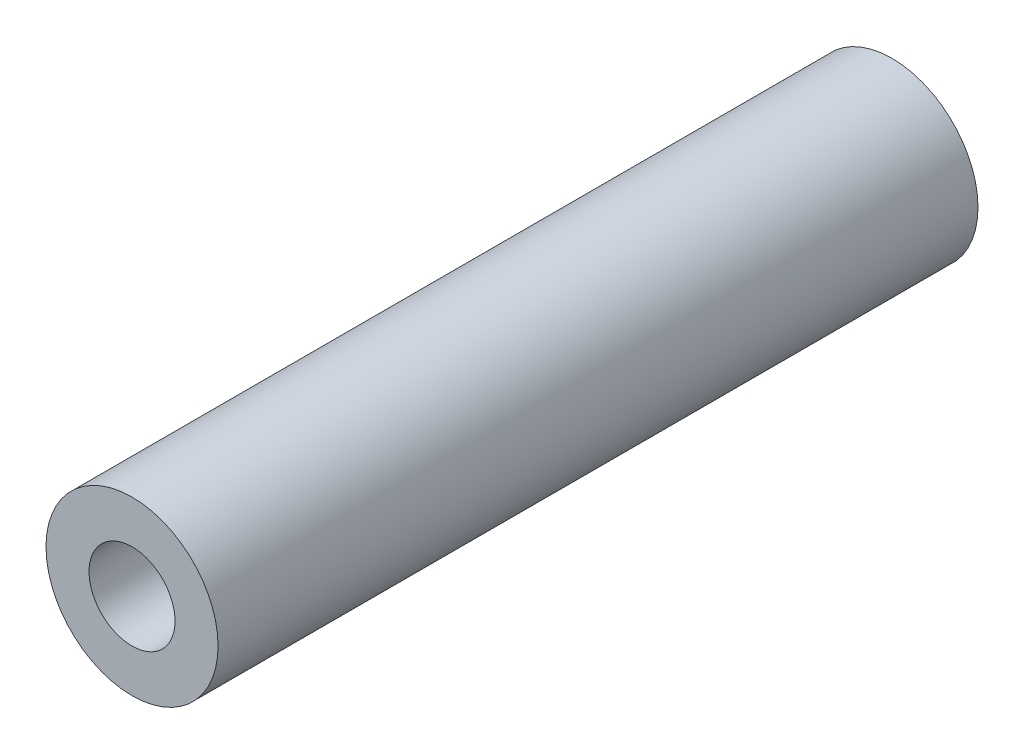
ISO-10303-21;
HEADER;
FILE_DESCRIPTION(('STEP AP214'),'2;1');
FILE_NAME('part.step','',(''),(''),'','','');
FILE_SCHEMA(('AUTOMOTIVE_DESIGN { 1 0 10303 214 1 1 1 1 }'));
ENDSEC;
DATA;
#1=APPLICATION_CONTEXT('core data for automotive mechanical design processes');
#2=APPLICATION_PROTOCOL_DEFINITION('international standard','automotive_design',2000,#1);
#3=PRODUCT_CONTEXT('',#1,'mechanical');
#4=PRODUCT('Part','Part','',(#3));
#5=PRODUCT_RELATED_PRODUCT_CATEGORY('part','',(#4));
#6=PRODUCT_DEFINITION_FORMATION('','',#4);
#7=PRODUCT_DEFINITION_CONTEXT('part definition',#1,'design');
#8=PRODUCT_DEFINITION('design','',#6,#7);
#9=PRODUCT_DEFINITION_SHAPE('','',#8);
#10=(LENGTH_UNIT() NAMED_UNIT(*) SI_UNIT(.MILLI.,.METRE.));
#11=(NAMED_UNIT(*) PLANE_ANGLE_UNIT() SI_UNIT($,.RADIAN.));
#12=(NAMED_UNIT(*) SI_UNIT($,.STERADIAN.) SOLID_ANGLE_UNIT());
#13=UNCERTAINTY_MEASURE_WITH_UNIT(LENGTH_MEASURE(1.E-05),#10,'distance_accuracy_value','');
#14=(GEOMETRIC_REPRESENTATION_CONTEXT(3) GLOBAL_UNCERTAINTY_ASSIGNED_CONTEXT((#13)) GLOBAL_UNIT_ASSIGNED_CONTEXT((#10,
#11,#12)) REPRESENTATION_CONTEXT('',''));
#15=CARTESIAN_POINT('',(0.,0.,0.));
#16=DIRECTION('',(0.,0.,1.));
#17=DIRECTION('',(1.,0.,0.));
#18=AXIS2_PLACEMENT_3D('',#15,#16,#17);
#19=CARTESIAN_POINT('',(0.,0.,26.5));
#20=DIRECTION('',(0.,0.,1.));
#21=DIRECTION('',(1.,0.,0.));
#22=AXIS2_PLACEMENT_3D('',#19,#20,#21);
#23=PLANE('',#22);
#24=CARTESIAN_POINT('',(0.,0.,26.5));
#25=DIRECTION('',(0.,0.,1.));
#26=DIRECTION('',(1.,0.,0.));
#27=AXIS2_PLACEMENT_3D('',#24,#25,#26);
#28=CIRCLE('',#27,3.);
#29=CARTESIAN_POINT('',(3.,0.,26.5));
#30=VERTEX_POINT('',#29);
#31=EDGE_CURVE('E10',#30,#30,#28,.T.);
#32=ORIENTED_EDGE('',*,*,#31,.T.);
#33=EDGE_LOOP('',(#32));
#34=FACE_BOUND('',#33,.T.);
#35=CARTESIAN_POINT('',(0.,0.,26.5));
#36=DIRECTION('',(0.,0.,1.));
#37=DIRECTION('',(1.,0.,0.));
#38=AXIS2_PLACEMENT_3D('',#35,#36,#37);
#39=CIRCLE('',#38,1.5);
#40=CARTESIAN_POINT('',(1.5,0.,26.5));
#41=VERTEX_POINT('',#40);
#42=EDGE_CURVE('E59',#41,#41,#39,.T.);
#43=ORIENTED_EDGE('',*,*,#42,.F.);
#44=EDGE_LOOP('',(#43));
#45=FACE_BOUND('',#44,.T.);
#46=ADVANCED_FACE('F50',(#34,#45),#23,.T.);
#47=CARTESIAN_POINT('',(0.,0.,0.));
#48=DIRECTION('',(0.,0.,1.));
#49=DIRECTION('',(1.,0.,0.));
#50=AXIS2_PLACEMENT_3D('',#47,#48,#49);
#51=PLANE('',#50);
#52=CARTESIAN_POINT('',(0.,0.,0.));
#53=DIRECTION('',(0.,0.,1.));
#54=DIRECTION('',(1.,0.,0.));
#55=AXIS2_PLACEMENT_3D('',#52,#53,#54);
#56=CIRCLE('',#55,3.);
#57=CARTESIAN_POINT('',(3.,0.,0.));
#58=VERTEX_POINT('',#57);
#59=EDGE_CURVE('E51',#58,#58,#56,.T.);
#60=ORIENTED_EDGE('',*,*,#59,.F.);
#61=EDGE_LOOP('',(#60));
#62=FACE_BOUND('',#61,.T.);
#63=CARTESIAN_POINT('',(0.,0.,0.));
#64=DIRECTION('',(0.,0.,1.));
#65=DIRECTION('',(1.,0.,0.));
#66=AXIS2_PLACEMENT_3D('',#63,#64,#65);
#67=CIRCLE('',#66,1.5);
#68=CARTESIAN_POINT('',(1.5,0.,0.));
#69=VERTEX_POINT('',#68);
#70=EDGE_CURVE('E58',#69,#69,#67,.T.);
#71=ORIENTED_EDGE('',*,*,#70,.T.);
#72=EDGE_LOOP('',(#71));
#73=FACE_BOUND('',#72,.T.);
#74=ADVANCED_FACE('F66',(#62,#73),#51,.F.);
#75=CARTESIAN_POINT('',(0.,0.,26.5));
#76=DIRECTION('',(0.,0.,-1.));
#77=DIRECTION('',(-1.,0.,0.));
#78=AXIS2_PLACEMENT_3D('',#75,#76,#77);
#79=CYLINDRICAL_SURFACE('',#78,3.);
#80=ORIENTED_EDGE('',*,*,#31,.F.);
#81=EDGE_LOOP('',(#80));
#82=FACE_BOUND('',#81,.T.);
#83=ORIENTED_EDGE('',*,*,#59,.T.);
#84=EDGE_LOOP('',(#83));
#85=FACE_BOUND('',#84,.T.);
#86=ADVANCED_FACE('F47',(#82,#85),#79,.T.);
#87=CARTESIAN_POINT('',(0.,0.,26.5));
#88=DIRECTION('',(0.,0.,-1.));
#89=DIRECTION('',(-1.,0.,0.));
#90=AXIS2_PLACEMENT_3D('',#87,#88,#89);
#91=CYLINDRICAL_SURFACE('',#90,1.5);
#92=ORIENTED_EDGE('',*,*,#42,.T.);
#93=EDGE_LOOP('',(#92));
#94=FACE_BOUND('',#93,.T.);
#95=ORIENTED_EDGE('',*,*,#70,.F.);
#96=EDGE_LOOP('',(#95));
#97=FACE_BOUND('',#96,.T.);
#98=ADVANCED_FACE('F68',(#94,#97),#91,.F.);
#99=CLOSED_SHELL('',(#46,#74,#86,#98));
#100=MANIFOLD_SOLID_BREP('B2',#99);
#101=ADVANCED_BREP_SHAPE_REPRESENTATION('',(#18,#100),#14);
#102=SHAPE_DEFINITION_REPRESENTATION(#9,#101);
ENDSEC;
END-ISO-10303-21;
